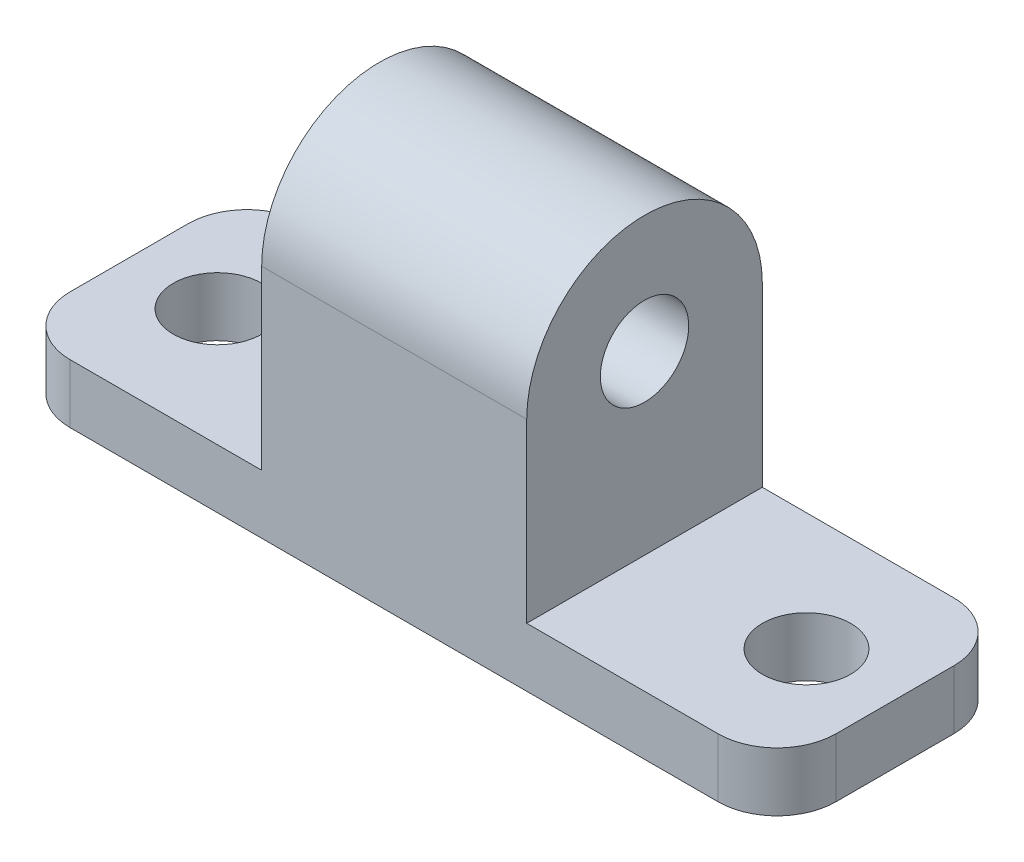
ISO-10303-21;
HEADER;
FILE_DESCRIPTION(('STEP AP214'),'2;1');
FILE_NAME('part.step','',(''),(''),'','','');
FILE_SCHEMA(('AUTOMOTIVE_DESIGN { 1 0 10303 214 1 1 1 1 }'));
ENDSEC;
DATA;
#1=APPLICATION_CONTEXT('core data for automotive mechanical design processes');
#2=APPLICATION_PROTOCOL_DEFINITION('international standard','automotive_design',2000,#1);
#3=PRODUCT_CONTEXT('',#1,'mechanical');
#4=PRODUCT('Part','Part','',(#3));
#5=PRODUCT_RELATED_PRODUCT_CATEGORY('part','',(#4));
#6=PRODUCT_DEFINITION_FORMATION('','',#4);
#7=PRODUCT_DEFINITION_CONTEXT('part definition',#1,'design');
#8=PRODUCT_DEFINITION('design','',#6,#7);
#9=PRODUCT_DEFINITION_SHAPE('','',#8);
#10=(LENGTH_UNIT() NAMED_UNIT(*) SI_UNIT(.MILLI.,.METRE.));
#11=(NAMED_UNIT(*) PLANE_ANGLE_UNIT() SI_UNIT($,.RADIAN.));
#12=(NAMED_UNIT(*) SI_UNIT($,.STERADIAN.) SOLID_ANGLE_UNIT());
#13=UNCERTAINTY_MEASURE_WITH_UNIT(LENGTH_MEASURE(1.E-05),#10,'distance_accuracy_value','');
#14=(GEOMETRIC_REPRESENTATION_CONTEXT(3) GLOBAL_UNCERTAINTY_ASSIGNED_CONTEXT((#13)) GLOBAL_UNIT_ASSIGNED_CONTEXT((#10,
#11,#12)) REPRESENTATION_CONTEXT('',''));
#15=CARTESIAN_POINT('',(0.,0.,0.));
#16=DIRECTION('',(0.,0.,1.));
#17=DIRECTION('',(1.,0.,0.));
#18=AXIS2_PLACEMENT_3D('',#15,#16,#17);
#19=CARTESIAN_POINT('',(0.,0.,8.));
#20=DIRECTION('',(0.,0.,1.));
#21=DIRECTION('',(1.,0.,0.));
#22=AXIS2_PLACEMENT_3D('',#19,#20,#21);
#23=PLANE('',#22);
#24=DIRECTION('',(1.,0.,0.));
#25=VECTOR('',#24,1.);
#26=CARTESIAN_POINT('',(-4.5,-4.,8.));
#27=LINE('',#26,#25);
#28=CARTESIAN_POINT('',(-11.,-4.,8.));
#29=VERTEX_POINT('',#28);
#30=CARTESIAN_POINT('',(-4.5,-4.,8.));
#31=VERTEX_POINT('',#30);
#32=EDGE_CURVE('E138',#29,#31,#27,.T.);
#33=ORIENTED_EDGE('',*,*,#32,.F.);
#34=DIRECTION('',(0.,-1.,0.));
#35=VECTOR('',#34,1.);
#36=CARTESIAN_POINT('',(-11.,-6.,8.));
#37=LINE('',#36,#35);
#38=CARTESIAN_POINT('',(-11.,-6.,8.));
#39=VERTEX_POINT('',#38);
#40=EDGE_CURVE('E216',#29,#39,#37,.T.);
#41=ORIENTED_EDGE('',*,*,#40,.T.);
#42=DIRECTION('',(1.,0.,0.));
#43=VECTOR('',#42,1.);
#44=CARTESIAN_POINT('',(-13.,-6.,8.));
#45=LINE('',#44,#43);
#46=CARTESIAN_POINT('',(11.,-6.,8.));
#47=VERTEX_POINT('',#46);
#48=EDGE_CURVE('E176',#39,#47,#45,.T.);
#49=ORIENTED_EDGE('',*,*,#48,.T.);
#50=DIRECTION('',(0.,1.,0.));
#51=VECTOR('',#50,1.);
#52=CARTESIAN_POINT('',(11.,-4.,8.));
#53=LINE('',#52,#51);
#54=CARTESIAN_POINT('',(11.,-4.,8.));
#55=VERTEX_POINT('',#54);
#56=EDGE_CURVE('E213',#47,#55,#53,.T.);
#57=ORIENTED_EDGE('',*,*,#56,.T.);
#58=DIRECTION('',(1.,0.,0.));
#59=VECTOR('',#58,1.);
#60=CARTESIAN_POINT('',(4.5,-4.,8.));
#61=LINE('',#60,#59);
#62=CARTESIAN_POINT('',(4.5,-4.,8.));
#63=VERTEX_POINT('',#62);
#64=EDGE_CURVE('E161',#63,#55,#61,.T.);
#65=ORIENTED_EDGE('',*,*,#64,.F.);
#66=DIRECTION('',(0.,-1.,0.));
#67=VECTOR('',#66,1.);
#68=CARTESIAN_POINT('',(4.5,6.,8.));
#69=LINE('',#68,#67);
#70=CARTESIAN_POINT('',(4.5,2.,8.));
#71=VERTEX_POINT('',#70);
#72=EDGE_CURVE('E142',#71,#63,#69,.T.);
#73=ORIENTED_EDGE('',*,*,#72,.F.);
#74=DIRECTION('',(1.,0.,0.));
#75=VECTOR('',#74,1.);
#76=CARTESIAN_POINT('',(-13.,2.,8.));
#77=LINE('',#76,#75);
#78=CARTESIAN_POINT('',(-4.5,2.,8.));
#79=VERTEX_POINT('',#78);
#80=EDGE_CURVE('E172',#79,#71,#77,.T.);
#81=ORIENTED_EDGE('',*,*,#80,.F.);
#82=DIRECTION('',(0.,1.,0.));
#83=VECTOR('',#82,1.);
#84=CARTESIAN_POINT('',(-4.5,6.,8.));
#85=LINE('',#84,#83);
#86=EDGE_CURVE('E147',#31,#79,#85,.T.);
#87=ORIENTED_EDGE('',*,*,#86,.F.);
#88=EDGE_LOOP('',(#33,#41,#49,#57,#65,#73,#81,#87));
#89=FACE_BOUND('',#88,.T.);
#90=ADVANCED_FACE('F33',(#89),#23,.T.);
#91=CARTESIAN_POINT('',(0.,0.,0.));
#92=DIRECTION('',(0.,0.,1.));
#93=DIRECTION('',(1.,0.,0.));
#94=AXIS2_PLACEMENT_3D('',#91,#92,#93);
#95=PLANE('',#94);
#96=DIRECTION('',(1.,0.,0.));
#97=VECTOR('',#96,1.);
#98=CARTESIAN_POINT('',(-13.,-6.,0.));
#99=LINE('',#98,#97);
#100=CARTESIAN_POINT('',(-11.,-6.,0.));
#101=VERTEX_POINT('',#100);
#102=CARTESIAN_POINT('',(11.,-6.,0.));
#103=VERTEX_POINT('',#102);
#104=EDGE_CURVE('E174',#101,#103,#99,.T.);
#105=ORIENTED_EDGE('',*,*,#104,.F.);
#106=DIRECTION('',(0.,-1.,0.));
#107=VECTOR('',#106,1.);
#108=CARTESIAN_POINT('',(-11.,0.,0.));
#109=LINE('',#108,#107);
#110=CARTESIAN_POINT('',(-11.,-4.,0.));
#111=VERTEX_POINT('',#110);
#112=EDGE_CURVE('E129',#101,#111,#109,.F.);
#113=ORIENTED_EDGE('',*,*,#112,.T.);
#114=DIRECTION('',(1.,0.,0.));
#115=VECTOR('',#114,1.);
#116=CARTESIAN_POINT('',(-4.5,-4.,0.));
#117=LINE('',#116,#115);
#118=CARTESIAN_POINT('',(-4.5,-4.,0.));
#119=VERTEX_POINT('',#118);
#120=EDGE_CURVE('E121',#111,#119,#117,.T.);
#121=ORIENTED_EDGE('',*,*,#120,.T.);
#122=DIRECTION('',(0.,1.,0.));
#123=VECTOR('',#122,1.);
#124=CARTESIAN_POINT('',(-4.5,6.,0.));
#125=LINE('',#124,#123);
#126=CARTESIAN_POINT('',(-4.5,2.,0.));
#127=VERTEX_POINT('',#126);
#128=EDGE_CURVE('E126',#119,#127,#125,.T.);
#129=ORIENTED_EDGE('',*,*,#128,.T.);
#130=DIRECTION('',(1.,0.,0.));
#131=VECTOR('',#130,1.);
#132=CARTESIAN_POINT('',(-13.,2.,0.));
#133=LINE('',#132,#131);
#134=CARTESIAN_POINT('',(4.5,2.,0.));
#135=VERTEX_POINT('',#134);
#136=EDGE_CURVE('E169',#127,#135,#133,.T.);
#137=ORIENTED_EDGE('',*,*,#136,.T.);
#138=DIRECTION('',(0.,-1.,0.));
#139=VECTOR('',#138,1.);
#140=CARTESIAN_POINT('',(4.5,6.,0.));
#141=LINE('',#140,#139);
#142=CARTESIAN_POINT('',(4.5,-4.,0.));
#143=VERTEX_POINT('',#142);
#144=EDGE_CURVE('E157',#135,#143,#141,.T.);
#145=ORIENTED_EDGE('',*,*,#144,.T.);
#146=DIRECTION('',(1.,0.,0.));
#147=VECTOR('',#146,1.);
#148=CARTESIAN_POINT('',(4.5,-4.,0.));
#149=LINE('',#148,#147);
#150=CARTESIAN_POINT('',(11.,-4.,0.));
#151=VERTEX_POINT('',#150);
#152=EDGE_CURVE('E160',#143,#151,#149,.T.);
#153=ORIENTED_EDGE('',*,*,#152,.T.);
#154=DIRECTION('',(0.,1.,0.));
#155=VECTOR('',#154,1.);
#156=CARTESIAN_POINT('',(11.,0.,0.));
#157=LINE('',#156,#155);
#158=EDGE_CURVE('E206',#151,#103,#157,.F.);
#159=ORIENTED_EDGE('',*,*,#158,.T.);
#160=EDGE_LOOP('',(#105,#113,#121,#129,#137,#145,#153,#159));
#161=FACE_BOUND('',#160,.T.);
#162=ADVANCED_FACE('F124',(#161),#95,.F.);
#163=CARTESIAN_POINT('',(13.,6.,8.));
#164=DIRECTION('',(-1.,0.,0.));
#165=DIRECTION('',(0.,-1.,0.));
#166=AXIS2_PLACEMENT_3D('',#163,#164,#165);
#167=PLANE('',#166);
#168=DIRECTION('',(0.,0.,-1.));
#169=VECTOR('',#168,1.);
#170=CARTESIAN_POINT('',(13.,-6.,8.));
#171=LINE('',#170,#169);
#172=CARTESIAN_POINT('',(13.,-6.,6.));
#173=VERTEX_POINT('',#172);
#174=CARTESIAN_POINT('',(13.,-6.,2.));
#175=VERTEX_POINT('',#174);
#176=EDGE_CURVE('E179',#173,#175,#171,.T.);
#177=ORIENTED_EDGE('',*,*,#176,.T.);
#178=DIRECTION('',(0.,1.,0.));
#179=VECTOR('',#178,1.);
#180=CARTESIAN_POINT('',(13.,6.,2.));
#181=LINE('',#180,#179);
#182=CARTESIAN_POINT('',(13.,-4.,2.));
#183=VERTEX_POINT('',#182);
#184=EDGE_CURVE('E221',#175,#183,#181,.T.);
#185=ORIENTED_EDGE('',*,*,#184,.T.);
#186=DIRECTION('',(0.,0.,1.));
#187=VECTOR('',#186,1.);
#188=CARTESIAN_POINT('',(13.,-4.,0.));
#189=LINE('',#188,#187);
#190=CARTESIAN_POINT('',(13.,-4.,6.));
#191=VERTEX_POINT('',#190);
#192=EDGE_CURVE('E167',#183,#191,#189,.T.);
#193=ORIENTED_EDGE('',*,*,#192,.T.);
#194=DIRECTION('',(0.,1.,0.));
#195=VECTOR('',#194,1.);
#196=CARTESIAN_POINT('',(13.,-6.,6.));
#197=LINE('',#196,#195);
#198=EDGE_CURVE('E219',#191,#173,#197,.F.);
#199=ORIENTED_EDGE('',*,*,#198,.T.);
#200=EDGE_LOOP('',(#177,#185,#193,#199));
#201=FACE_BOUND('',#200,.T.);
#202=ADVANCED_FACE('F223',(#201),#167,.F.);
#203=CARTESIAN_POINT('',(-13.,6.,8.));
#204=DIRECTION('',(1.,0.,0.));
#205=DIRECTION('',(0.,1.,0.));
#206=AXIS2_PLACEMENT_3D('',#203,#204,#205);
#207=PLANE('',#206);
#208=DIRECTION('',(0.,0.,1.));
#209=VECTOR('',#208,1.);
#210=CARTESIAN_POINT('',(-13.,-4.,0.));
#211=LINE('',#210,#209);
#212=CARTESIAN_POINT('',(-13.,-4.,2.));
#213=VERTEX_POINT('',#212);
#214=CARTESIAN_POINT('',(-13.,-4.,6.));
#215=VERTEX_POINT('',#214);
#216=EDGE_CURVE('E132',#213,#215,#211,.T.);
#217=ORIENTED_EDGE('',*,*,#216,.F.);
#218=DIRECTION('',(0.,-1.,0.));
#219=VECTOR('',#218,1.);
#220=CARTESIAN_POINT('',(-13.,6.,2.));
#221=LINE('',#220,#219);
#222=CARTESIAN_POINT('',(-13.,-6.,2.));
#223=VERTEX_POINT('',#222);
#224=EDGE_CURVE('E195',#213,#223,#221,.T.);
#225=ORIENTED_EDGE('',*,*,#224,.T.);
#226=DIRECTION('',(0.,0.,-1.));
#227=VECTOR('',#226,1.);
#228=CARTESIAN_POINT('',(-13.,-6.,8.));
#229=LINE('',#228,#227);
#230=CARTESIAN_POINT('',(-13.,-6.,6.));
#231=VERTEX_POINT('',#230);
#232=EDGE_CURVE('E184',#231,#223,#229,.T.);
#233=ORIENTED_EDGE('',*,*,#232,.F.);
#234=DIRECTION('',(0.,-1.,0.));
#235=VECTOR('',#234,1.);
#236=CARTESIAN_POINT('',(-13.,-4.,6.));
#237=LINE('',#236,#235);
#238=EDGE_CURVE('E191',#231,#215,#237,.F.);
#239=ORIENTED_EDGE('',*,*,#238,.T.);
#240=EDGE_LOOP('',(#217,#225,#233,#239));
#241=FACE_BOUND('',#240,.T.);
#242=ADVANCED_FACE('F240',(#241),#207,.F.);
#243=CARTESIAN_POINT('',(-13.,-6.,8.));
#244=DIRECTION('',(0.,1.,0.));
#245=DIRECTION('',(0.,0.,1.));
#246=AXIS2_PLACEMENT_3D('',#243,#244,#245);
#247=PLANE('',#246);
#248=CARTESIAN_POINT('',(10.,-6.,4.));
#249=DIRECTION('',(0.,1.,0.));
#250=DIRECTION('',(-1.,0.,0.));
#251=AXIS2_PLACEMENT_3D('',#248,#249,#250);
#252=CIRCLE('',#251,1.5);
#253=CARTESIAN_POINT('',(8.5,-6.,4.));
#254=VERTEX_POINT('',#253);
#255=EDGE_CURVE('E369',#254,#254,#252,.T.);
#256=ORIENTED_EDGE('',*,*,#255,.T.);
#257=EDGE_LOOP('',(#256));
#258=FACE_BOUND('',#257,.T.);
#259=CARTESIAN_POINT('',(-10.,-6.,4.));
#260=DIRECTION('',(0.,1.,0.));
#261=DIRECTION('',(-1.,0.,0.));
#262=AXIS2_PLACEMENT_3D('',#259,#260,#261);
#263=CIRCLE('',#262,1.5);
#264=CARTESIAN_POINT('',(-11.5,-6.,4.));
#265=VERTEX_POINT('',#264);
#266=EDGE_CURVE('E362',#265,#265,#263,.T.);
#267=ORIENTED_EDGE('',*,*,#266,.T.);
#268=EDGE_LOOP('',(#267));
#269=FACE_BOUND('',#268,.T.);
#270=ORIENTED_EDGE('',*,*,#232,.T.);
#271=CARTESIAN_POINT('',(-11.,-6.,2.));
#272=DIRECTION('',(0.,1.,0.));
#273=DIRECTION('',(0.,0.,1.));
#274=AXIS2_PLACEMENT_3D('',#271,#272,#273);
#275=CIRCLE('',#274,2.);
#276=EDGE_CURVE('E204',#223,#101,#275,.F.);
#277=ORIENTED_EDGE('',*,*,#276,.T.);
#278=ORIENTED_EDGE('',*,*,#104,.T.);
#279=CARTESIAN_POINT('',(11.,-6.,2.));
#280=DIRECTION('',(0.,1.,0.));
#281=DIRECTION('',(0.,0.,1.));
#282=AXIS2_PLACEMENT_3D('',#279,#280,#281);
#283=CIRCLE('',#282,2.);
#284=EDGE_CURVE('E200',#103,#175,#283,.F.);
#285=ORIENTED_EDGE('',*,*,#284,.T.);
#286=ORIENTED_EDGE('',*,*,#176,.F.);
#287=CARTESIAN_POINT('',(11.,-6.,6.));
#288=DIRECTION('',(0.,1.,0.));
#289=DIRECTION('',(0.,0.,1.));
#290=AXIS2_PLACEMENT_3D('',#287,#288,#289);
#291=CIRCLE('',#290,2.);
#292=EDGE_CURVE('E198',#173,#47,#291,.F.);
#293=ORIENTED_EDGE('',*,*,#292,.T.);
#294=ORIENTED_EDGE('',*,*,#48,.F.);
#295=CARTESIAN_POINT('',(-11.,-6.,6.));
#296=DIRECTION('',(0.,1.,0.));
#297=DIRECTION('',(0.,0.,1.));
#298=AXIS2_PLACEMENT_3D('',#295,#296,#297);
#299=CIRCLE('',#298,2.);
#300=EDGE_CURVE('E202',#39,#231,#299,.F.);
#301=ORIENTED_EDGE('',*,*,#300,.T.);
#302=EDGE_LOOP('',(#270,#277,#278,#285,#286,#293,#294,#301));
#303=FACE_BOUND('',#302,.T.);
#304=ADVANCED_FACE('F232',(#258,#269,#303),#247,.F.);
#305=CARTESIAN_POINT('',(-13.,2.,4.));
#306=DIRECTION('',(1.,0.,0.));
#307=DIRECTION('',(0.,1.,0.));
#308=AXIS2_PLACEMENT_3D('',#305,#306,#307);
#309=CYLINDRICAL_SURFACE('',#308,4.);
#310=CARTESIAN_POINT('',(-4.5,2.,4.));
#311=DIRECTION('',(1.,0.,0.));
#312=DIRECTION('',(0.,1.,0.));
#313=AXIS2_PLACEMENT_3D('',#310,#311,#312);
#314=CIRCLE('',#313,4.);
#315=EDGE_CURVE('E145',#127,#79,#314,.T.);
#316=ORIENTED_EDGE('',*,*,#315,.T.);
#317=ORIENTED_EDGE('',*,*,#80,.T.);
#318=CARTESIAN_POINT('',(4.5,2.,4.));
#319=DIRECTION('',(-1.,0.,0.));
#320=DIRECTION('',(0.,0.,1.));
#321=AXIS2_PLACEMENT_3D('',#318,#319,#320);
#322=CIRCLE('',#321,4.);
#323=EDGE_CURVE('E187',#71,#135,#322,.T.);
#324=ORIENTED_EDGE('',*,*,#323,.T.);
#325=ORIENTED_EDGE('',*,*,#136,.F.);
#326=EDGE_LOOP('',(#316,#317,#324,#325));
#327=FACE_BOUND('',#326,.T.);
#328=ADVANCED_FACE('F253',(#327),#309,.T.);
#329=CARTESIAN_POINT('',(4.5,6.,0.));
#330=DIRECTION('',(-1.,0.,0.));
#331=DIRECTION('',(0.,0.,1.));
#332=AXIS2_PLACEMENT_3D('',#329,#330,#331);
#333=PLANE('',#332);
#334=CARTESIAN_POINT('',(4.5,2.,4.));
#335=DIRECTION('',(1.,0.,0.));
#336=DIRECTION('',(0.,1.,0.));
#337=AXIS2_PLACEMENT_3D('',#334,#335,#336);
#338=CIRCLE('',#337,1.5);
#339=CARTESIAN_POINT('',(4.5,3.5,4.));
#340=VERTEX_POINT('',#339);
#341=EDGE_CURVE('E150',#340,#340,#338,.T.);
#342=ORIENTED_EDGE('',*,*,#341,.F.);
#343=EDGE_LOOP('',(#342));
#344=FACE_BOUND('',#343,.T.);
#345=ORIENTED_EDGE('',*,*,#72,.T.);
#346=DIRECTION('',(0.,0.,1.));
#347=VECTOR('',#346,1.);
#348=CARTESIAN_POINT('',(4.5,-4.,0.));
#349=LINE('',#348,#347);
#350=EDGE_CURVE('E164',#143,#63,#349,.T.);
#351=ORIENTED_EDGE('',*,*,#350,.F.);
#352=ORIENTED_EDGE('',*,*,#144,.F.);
#353=ORIENTED_EDGE('',*,*,#323,.F.);
#354=EDGE_LOOP('',(#345,#351,#352,#353));
#355=FACE_BOUND('',#354,.T.);
#356=ADVANCED_FACE('F255',(#344,#355),#333,.F.);
#357=CARTESIAN_POINT('',(4.5,-4.,0.));
#358=DIRECTION('',(0.,-1.,0.));
#359=DIRECTION('',(0.,0.,-1.));
#360=AXIS2_PLACEMENT_3D('',#357,#358,#359);
#361=PLANE('',#360);
#362=CARTESIAN_POINT('',(10.,-4.,4.));
#363=DIRECTION('',(0.,1.,0.));
#364=DIRECTION('',(-1.,0.,0.));
#365=AXIS2_PLACEMENT_3D('',#362,#363,#364);
#366=CIRCLE('',#365,1.5);
#367=CARTESIAN_POINT('',(8.5,-4.,4.));
#368=VERTEX_POINT('',#367);
#369=EDGE_CURVE('E371',#368,#368,#366,.T.);
#370=ORIENTED_EDGE('',*,*,#369,.F.);
#371=EDGE_LOOP('',(#370));
#372=FACE_BOUND('',#371,.T.);
#373=ORIENTED_EDGE('',*,*,#192,.F.);
#374=CARTESIAN_POINT('',(11.,-4.,2.));
#375=DIRECTION('',(0.,-1.,0.));
#376=DIRECTION('',(0.,0.,-1.));
#377=AXIS2_PLACEMENT_3D('',#374,#375,#376);
#378=CIRCLE('',#377,2.);
#379=EDGE_CURVE('E11',#183,#151,#378,.F.);
#380=ORIENTED_EDGE('',*,*,#379,.T.);
#381=ORIENTED_EDGE('',*,*,#152,.F.);
#382=ORIENTED_EDGE('',*,*,#350,.T.);
#383=ORIENTED_EDGE('',*,*,#64,.T.);
#384=CARTESIAN_POINT('',(11.,-4.,6.));
#385=DIRECTION('',(0.,-1.,0.));
#386=DIRECTION('',(0.,0.,-1.));
#387=AXIS2_PLACEMENT_3D('',#384,#385,#386);
#388=CIRCLE('',#387,2.);
#389=EDGE_CURVE('E41',#55,#191,#388,.F.);
#390=ORIENTED_EDGE('',*,*,#389,.T.);
#391=EDGE_LOOP('',(#373,#380,#381,#382,#383,#390));
#392=FACE_BOUND('',#391,.T.);
#393=ADVANCED_FACE('F227',(#372,#392),#361,.F.);
#394=CARTESIAN_POINT('',(-4.5,6.,0.));
#395=DIRECTION('',(1.,0.,0.));
#396=DIRECTION('',(0.,1.,0.));
#397=AXIS2_PLACEMENT_3D('',#394,#395,#396);
#398=PLANE('',#397);
#399=CARTESIAN_POINT('',(-4.5,2.,4.));
#400=DIRECTION('',(1.,0.,0.));
#401=DIRECTION('',(0.,1.,0.));
#402=AXIS2_PLACEMENT_3D('',#399,#400,#401);
#403=CIRCLE('',#402,1.5);
#404=CARTESIAN_POINT('',(-4.5,3.5,4.));
#405=VERTEX_POINT('',#404);
#406=EDGE_CURVE('E153',#405,#405,#403,.T.);
#407=ORIENTED_EDGE('',*,*,#406,.T.);
#408=EDGE_LOOP('',(#407));
#409=FACE_BOUND('',#408,.T.);
#410=ORIENTED_EDGE('',*,*,#315,.F.);
#411=ORIENTED_EDGE('',*,*,#128,.F.);
#412=DIRECTION('',(0.,0.,1.));
#413=VECTOR('',#412,1.);
#414=CARTESIAN_POINT('',(-4.5,-4.,0.));
#415=LINE('',#414,#413);
#416=EDGE_CURVE('E135',#119,#31,#415,.T.);
#417=ORIENTED_EDGE('',*,*,#416,.T.);
#418=ORIENTED_EDGE('',*,*,#86,.T.);
#419=EDGE_LOOP('',(#410,#411,#417,#418));
#420=FACE_BOUND('',#419,.T.);
#421=ADVANCED_FACE('F144',(#409,#420),#398,.F.);
#422=CARTESIAN_POINT('',(-4.5,-4.,0.));
#423=DIRECTION('',(0.,-1.,0.));
#424=DIRECTION('',(0.,0.,-1.));
#425=AXIS2_PLACEMENT_3D('',#422,#423,#424);
#426=PLANE('',#425);
#427=CARTESIAN_POINT('',(-10.,-4.,4.));
#428=DIRECTION('',(0.,1.,0.));
#429=DIRECTION('',(-1.,0.,0.));
#430=AXIS2_PLACEMENT_3D('',#427,#428,#429);
#431=CIRCLE('',#430,1.5);
#432=CARTESIAN_POINT('',(-11.5,-4.,4.));
#433=VERTEX_POINT('',#432);
#434=EDGE_CURVE('E364',#433,#433,#431,.T.);
#435=ORIENTED_EDGE('',*,*,#434,.F.);
#436=EDGE_LOOP('',(#435));
#437=FACE_BOUND('',#436,.T.);
#438=ORIENTED_EDGE('',*,*,#120,.F.);
#439=CARTESIAN_POINT('',(-11.,-4.,2.));
#440=DIRECTION('',(0.,-1.,0.));
#441=DIRECTION('',(0.,0.,-1.));
#442=AXIS2_PLACEMENT_3D('',#439,#440,#441);
#443=CIRCLE('',#442,2.);
#444=EDGE_CURVE('E211',#111,#213,#443,.F.);
#445=ORIENTED_EDGE('',*,*,#444,.T.);
#446=ORIENTED_EDGE('',*,*,#216,.T.);
#447=CARTESIAN_POINT('',(-11.,-4.,6.));
#448=DIRECTION('',(0.,-1.,0.));
#449=DIRECTION('',(0.,0.,-1.));
#450=AXIS2_PLACEMENT_3D('',#447,#448,#449);
#451=CIRCLE('',#450,2.);
#452=EDGE_CURVE('E209',#215,#29,#451,.F.);
#453=ORIENTED_EDGE('',*,*,#452,.T.);
#454=ORIENTED_EDGE('',*,*,#32,.T.);
#455=ORIENTED_EDGE('',*,*,#416,.F.);
#456=EDGE_LOOP('',(#438,#445,#446,#453,#454,#455));
#457=FACE_BOUND('',#456,.T.);
#458=ADVANCED_FACE('F136',(#437,#457),#426,.F.);
#459=CARTESIAN_POINT('',(-13.,2.,4.));
#460=DIRECTION('',(1.,0.,0.));
#461=DIRECTION('',(0.,1.,0.));
#462=AXIS2_PLACEMENT_3D('',#459,#460,#461);
#463=CYLINDRICAL_SURFACE('',#462,1.5);
#464=ORIENTED_EDGE('',*,*,#341,.T.);
#465=EDGE_LOOP('',(#464));
#466=FACE_BOUND('',#465,.T.);
#467=ORIENTED_EDGE('',*,*,#406,.F.);
#468=EDGE_LOOP('',(#467));
#469=FACE_BOUND('',#468,.T.);
#470=ADVANCED_FACE('F285',(#466,#469),#463,.F.);
#471=CARTESIAN_POINT('',(-11.,6.,2.));
#472=DIRECTION('',(0.,-1.,0.));
#473=DIRECTION('',(1.,0.,0.));
#474=AXIS2_PLACEMENT_3D('',#471,#472,#473);
#475=CYLINDRICAL_SURFACE('',#474,2.);
#476=ORIENTED_EDGE('',*,*,#444,.F.);
#477=ORIENTED_EDGE('',*,*,#112,.F.);
#478=ORIENTED_EDGE('',*,*,#276,.F.);
#479=ORIENTED_EDGE('',*,*,#224,.F.);
#480=EDGE_LOOP('',(#476,#477,#478,#479));
#481=FACE_BOUND('',#480,.T.);
#482=ADVANCED_FACE('F235',(#481),#475,.T.);
#483=CARTESIAN_POINT('',(-11.,0.,6.));
#484=DIRECTION('',(0.,1.,0.));
#485=DIRECTION('',(-1.,0.,0.));
#486=AXIS2_PLACEMENT_3D('',#483,#484,#485);
#487=CYLINDRICAL_SURFACE('',#486,2.);
#488=ORIENTED_EDGE('',*,*,#452,.F.);
#489=ORIENTED_EDGE('',*,*,#238,.F.);
#490=ORIENTED_EDGE('',*,*,#300,.F.);
#491=ORIENTED_EDGE('',*,*,#40,.F.);
#492=EDGE_LOOP('',(#488,#489,#490,#491));
#493=FACE_BOUND('',#492,.T.);
#494=ADVANCED_FACE('F244',(#493),#487,.T.);
#495=CARTESIAN_POINT('',(11.,6.,2.));
#496=DIRECTION('',(0.,1.,0.));
#497=DIRECTION('',(-1.,0.,0.));
#498=AXIS2_PLACEMENT_3D('',#495,#496,#497);
#499=CYLINDRICAL_SURFACE('',#498,2.);
#500=ORIENTED_EDGE('',*,*,#284,.F.);
#501=ORIENTED_EDGE('',*,*,#158,.F.);
#502=ORIENTED_EDGE('',*,*,#379,.F.);
#503=ORIENTED_EDGE('',*,*,#184,.F.);
#504=EDGE_LOOP('',(#500,#501,#502,#503));
#505=FACE_BOUND('',#504,.T.);
#506=ADVANCED_FACE('F230',(#505),#499,.T.);
#507=CARTESIAN_POINT('',(11.,0.,6.));
#508=DIRECTION('',(0.,-1.,0.));
#509=DIRECTION('',(1.,0.,0.));
#510=AXIS2_PLACEMENT_3D('',#507,#508,#509);
#511=CYLINDRICAL_SURFACE('',#510,2.);
#512=ORIENTED_EDGE('',*,*,#292,.F.);
#513=ORIENTED_EDGE('',*,*,#198,.F.);
#514=ORIENTED_EDGE('',*,*,#389,.F.);
#515=ORIENTED_EDGE('',*,*,#56,.F.);
#516=EDGE_LOOP('',(#512,#513,#514,#515));
#517=FACE_BOUND('',#516,.T.);
#518=ADVANCED_FACE('F35',(#517),#511,.T.);
#519=CARTESIAN_POINT('',(-10.,-6.,4.));
#520=DIRECTION('',(0.,1.,0.));
#521=DIRECTION('',(-1.,0.,0.));
#522=AXIS2_PLACEMENT_3D('',#519,#520,#521);
#523=CYLINDRICAL_SURFACE('',#522,1.5);
#524=ORIENTED_EDGE('',*,*,#266,.F.);
#525=EDGE_LOOP('',(#524));
#526=FACE_BOUND('',#525,.T.);
#527=ORIENTED_EDGE('',*,*,#434,.T.);
#528=EDGE_LOOP('',(#527));
#529=FACE_BOUND('',#528,.T.);
#530=ADVANCED_FACE('F259',(#526,#529),#523,.F.);
#531=CARTESIAN_POINT('',(10.,-6.,4.));
#532=DIRECTION('',(0.,1.,0.));
#533=DIRECTION('',(-1.,0.,0.));
#534=AXIS2_PLACEMENT_3D('',#531,#532,#533);
#535=CYLINDRICAL_SURFACE('',#534,1.5);
#536=ORIENTED_EDGE('',*,*,#255,.F.);
#537=EDGE_LOOP('',(#536));
#538=FACE_BOUND('',#537,.T.);
#539=ORIENTED_EDGE('',*,*,#369,.T.);
#540=EDGE_LOOP('',(#539));
#541=FACE_BOUND('',#540,.T.);
#542=ADVANCED_FACE('F264',(#538,#541),#535,.F.);
#543=CLOSED_SHELL('',(#90,#162,#202,#242,#304,#328,#356,#393,#421,#458,#470,#482,#494,#506,#518,
#530,#542));
#544=MANIFOLD_SOLID_BREP('B2',#543);
#545=ADVANCED_BREP_SHAPE_REPRESENTATION('',(#18,#544),#14);
#546=SHAPE_DEFINITION_REPRESENTATION(#9,#545);
ENDSEC;
END-ISO-10303-21;
